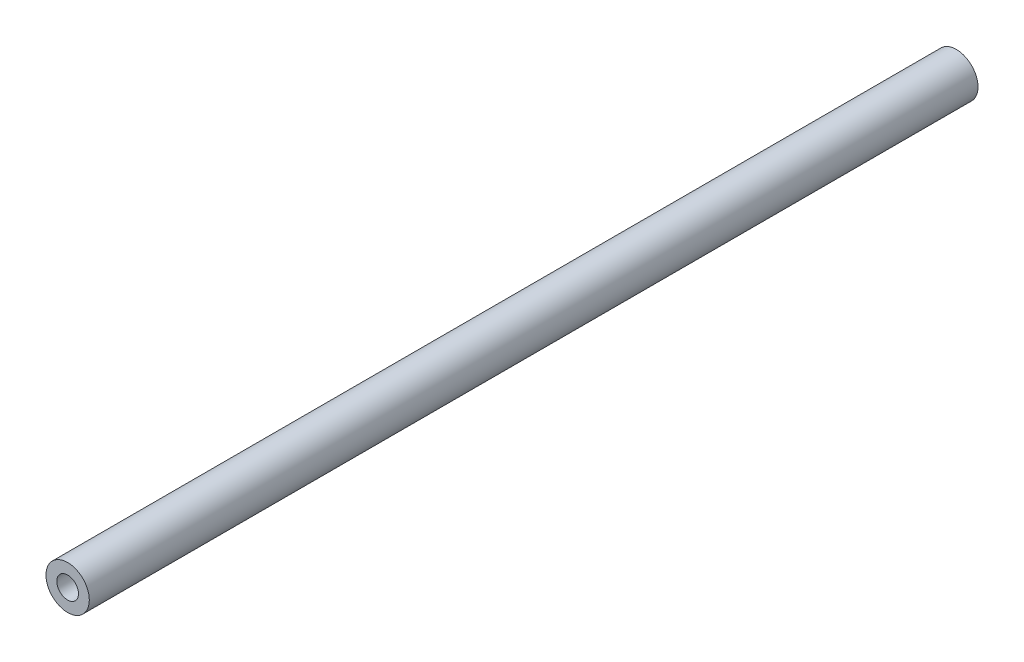
ISO-10303-21;
HEADER;
FILE_DESCRIPTION(('STEP AP214'),'2;1');
FILE_NAME('part.step','',(''),(''),'','','');
FILE_SCHEMA(('AUTOMOTIVE_DESIGN { 1 0 10303 214 1 1 1 1 }'));
ENDSEC;
DATA;
#1=APPLICATION_CONTEXT('core data for automotive mechanical design processes');
#2=APPLICATION_PROTOCOL_DEFINITION('international standard','automotive_design',2000,#1);
#3=PRODUCT_CONTEXT('',#1,'mechanical');
#4=PRODUCT('Part','Part','',(#3));
#5=PRODUCT_RELATED_PRODUCT_CATEGORY('part','',(#4));
#6=PRODUCT_DEFINITION_FORMATION('','',#4);
#7=PRODUCT_DEFINITION_CONTEXT('part definition',#1,'design');
#8=PRODUCT_DEFINITION('design','',#6,#7);
#9=PRODUCT_DEFINITION_SHAPE('','',#8);
#10=(LENGTH_UNIT() NAMED_UNIT(*) SI_UNIT(.MILLI.,.METRE.));
#11=(NAMED_UNIT(*) PLANE_ANGLE_UNIT() SI_UNIT($,.RADIAN.));
#12=(NAMED_UNIT(*) SI_UNIT($,.STERADIAN.) SOLID_ANGLE_UNIT());
#13=UNCERTAINTY_MEASURE_WITH_UNIT(LENGTH_MEASURE(1.E-05),#10,'distance_accuracy_value','');
#14=(GEOMETRIC_REPRESENTATION_CONTEXT(3) GLOBAL_UNCERTAINTY_ASSIGNED_CONTEXT((#13)) GLOBAL_UNIT_ASSIGNED_CONTEXT((#10,
#11,#12)) REPRESENTATION_CONTEXT('',''));
#15=CARTESIAN_POINT('',(0.,0.,0.));
#16=DIRECTION('',(0.,0.,1.));
#17=DIRECTION('',(1.,0.,0.));
#18=AXIS2_PLACEMENT_3D('',#15,#16,#17);
#19=CARTESIAN_POINT('',(0.,0.,82.));
#20=DIRECTION('',(0.,0.,1.));
#21=DIRECTION('',(1.,0.,0.));
#22=AXIS2_PLACEMENT_3D('',#19,#20,#21);
#23=PLANE('',#22);
#24=CARTESIAN_POINT('',(0.,0.,82.));
#25=DIRECTION('',(0.,0.,1.));
#26=DIRECTION('',(1.,0.,0.));
#27=AXIS2_PLACEMENT_3D('',#24,#25,#26);
#28=CIRCLE('',#27,2.);
#29=CARTESIAN_POINT('',(1.99999999999999,0.,82.));
#30=VERTEX_POINT('',#29);
#31=EDGE_CURVE('E12',#30,#30,#28,.T.);
#32=ORIENTED_EDGE('',*,*,#31,.T.);
#33=EDGE_LOOP('',(#32));
#34=FACE_BOUND('',#33,.T.);
#35=CARTESIAN_POINT('',(0.,0.,82.));
#36=DIRECTION('',(0.,0.,1.));
#37=DIRECTION('',(1.,0.,0.));
#38=AXIS2_PLACEMENT_3D('',#35,#36,#37);
#39=CIRCLE('',#38,1.00000000000002);
#40=CARTESIAN_POINT('',(1.,0.,82.));
#41=VERTEX_POINT('',#40);
#42=EDGE_CURVE('E52',#41,#41,#39,.T.);
#43=ORIENTED_EDGE('',*,*,#42,.F.);
#44=EDGE_LOOP('',(#43));
#45=FACE_BOUND('',#44,.T.);
#46=ADVANCED_FACE('F41',(#34,#45),#23,.T.);
#47=CARTESIAN_POINT('',(0.,0.,0.));
#48=DIRECTION('',(0.,0.,1.));
#49=DIRECTION('',(1.,0.,0.));
#50=AXIS2_PLACEMENT_3D('',#47,#48,#49);
#51=PLANE('',#50);
#52=CARTESIAN_POINT('',(0.,0.,0.));
#53=DIRECTION('',(0.,0.,1.));
#54=DIRECTION('',(1.,0.,0.));
#55=AXIS2_PLACEMENT_3D('',#52,#53,#54);
#56=CIRCLE('',#55,2.);
#57=CARTESIAN_POINT('',(1.99999999999999,0.,0.));
#58=VERTEX_POINT('',#57);
#59=EDGE_CURVE('E45',#58,#58,#56,.T.);
#60=ORIENTED_EDGE('',*,*,#59,.F.);
#61=EDGE_LOOP('',(#60));
#62=FACE_BOUND('',#61,.T.);
#63=CARTESIAN_POINT('',(0.,0.,0.));
#64=DIRECTION('',(0.,0.,1.));
#65=DIRECTION('',(1.,0.,0.));
#66=AXIS2_PLACEMENT_3D('',#63,#64,#65);
#67=CIRCLE('',#66,1.00000000000002);
#68=CARTESIAN_POINT('',(1.,0.,0.));
#69=VERTEX_POINT('',#68);
#70=EDGE_CURVE('E54',#69,#69,#67,.T.);
#71=ORIENTED_EDGE('',*,*,#70,.T.);
#72=EDGE_LOOP('',(#71));
#73=FACE_BOUND('',#72,.T.);
#74=ADVANCED_FACE('F64',(#62,#73),#51,.F.);
#75=CARTESIAN_POINT('',(0.,0.,82.));
#76=DIRECTION('',(0.,0.,-1.));
#77=DIRECTION('',(-1.,0.,0.));
#78=AXIS2_PLACEMENT_3D('',#75,#76,#77);
#79=CYLINDRICAL_SURFACE('',#78,2.);
#80=ORIENTED_EDGE('',*,*,#31,.F.);
#81=EDGE_LOOP('',(#80));
#82=FACE_BOUND('',#81,.T.);
#83=ORIENTED_EDGE('',*,*,#59,.T.);
#84=EDGE_LOOP('',(#83));
#85=FACE_BOUND('',#84,.T.);
#86=ADVANCED_FACE('F43',(#82,#85),#79,.T.);
#87=CARTESIAN_POINT('',(0.,0.,82.));
#88=DIRECTION('',(0.,0.,-1.));
#89=DIRECTION('',(-1.,0.,0.));
#90=AXIS2_PLACEMENT_3D('',#87,#88,#89);
#91=CYLINDRICAL_SURFACE('',#90,1.00000000000002);
#92=ORIENTED_EDGE('',*,*,#42,.T.);
#93=EDGE_LOOP('',(#92));
#94=FACE_BOUND('',#93,.T.);
#95=ORIENTED_EDGE('',*,*,#70,.F.);
#96=EDGE_LOOP('',(#95));
#97=FACE_BOUND('',#96,.T.);
#98=ADVANCED_FACE('F60',(#94,#97),#91,.F.);
#99=CLOSED_SHELL('',(#46,#74,#86,#98));
#100=MANIFOLD_SOLID_BREP('B2',#99);
#101=ADVANCED_BREP_SHAPE_REPRESENTATION('',(#18,#100),#14);
#102=SHAPE_DEFINITION_REPRESENTATION(#9,#101);
ENDSEC;
END-ISO-10303-21;
